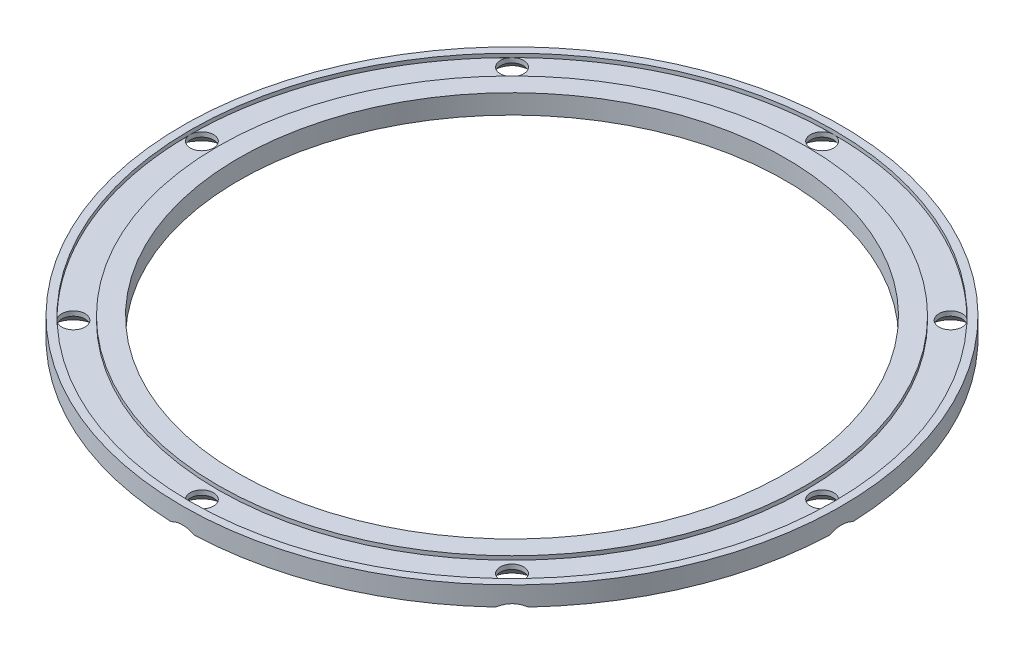
ISO-10303-21;
HEADER;
FILE_DESCRIPTION(('STEP AP214'),'2;1');
FILE_NAME('part.step','',(''),(''),'','','');
FILE_SCHEMA(('AUTOMOTIVE_DESIGN { 1 0 10303 214 1 1 1 1 }'));
ENDSEC;
DATA;
#1=APPLICATION_CONTEXT('core data for automotive mechanical design processes');
#2=APPLICATION_PROTOCOL_DEFINITION('international standard','automotive_design',2000,#1);
#3=PRODUCT_CONTEXT('',#1,'mechanical');
#4=PRODUCT('Part','Part','',(#3));
#5=PRODUCT_RELATED_PRODUCT_CATEGORY('part','',(#4));
#6=PRODUCT_DEFINITION_FORMATION('','',#4);
#7=PRODUCT_DEFINITION_CONTEXT('part definition',#1,'design');
#8=PRODUCT_DEFINITION('design','',#6,#7);
#9=PRODUCT_DEFINITION_SHAPE('','',#8);
#10=(LENGTH_UNIT() NAMED_UNIT(*) SI_UNIT(.MILLI.,.METRE.));
#11=(NAMED_UNIT(*) PLANE_ANGLE_UNIT() SI_UNIT($,.RADIAN.));
#12=(NAMED_UNIT(*) SI_UNIT($,.STERADIAN.) SOLID_ANGLE_UNIT());
#13=UNCERTAINTY_MEASURE_WITH_UNIT(LENGTH_MEASURE(1.E-05),#10,'distance_accuracy_value','');
#14=(GEOMETRIC_REPRESENTATION_CONTEXT(3) GLOBAL_UNCERTAINTY_ASSIGNED_CONTEXT((#13)) GLOBAL_UNIT_ASSIGNED_CONTEXT((#10,
#11,#12)) REPRESENTATION_CONTEXT('',''));
#15=CARTESIAN_POINT('',(0.,0.,0.));
#16=DIRECTION('',(0.,0.,1.));
#17=DIRECTION('',(1.,0.,0.));
#18=AXIS2_PLACEMENT_3D('',#15,#16,#17);
#19=CARTESIAN_POINT('',(0.,0.,0.));
#20=DIRECTION('',(0.,1.,0.));
#21=DIRECTION('',(0.,0.,1.));
#22=AXIS2_PLACEMENT_3D('',#19,#20,#21);
#23=PLANE('',#22);
#24=CARTESIAN_POINT('',(0.,0.,0.));
#25=DIRECTION('',(0.,1.,0.));
#26=DIRECTION('',(0.,0.,1.));
#27=AXIS2_PLACEMENT_3D('',#24,#25,#26);
#28=CIRCLE('',#27,35.25);
#29=CARTESIAN_POINT('',(0.,0.,35.25));
#30=VERTEX_POINT('',#29);
#31=EDGE_CURVE('E153',#30,#30,#28,.T.);
#32=ORIENTED_EDGE('',*,*,#31,.T.);
#33=EDGE_LOOP('',(#32));
#34=FACE_BOUND('',#33,.T.);
#35=CARTESIAN_POINT('',(-28.2842712474619,0.,28.2842712474619));
#36=DIRECTION('',(0.,-1.,0.));
#37=DIRECTION('',(0.,0.,-1.));
#38=AXIS2_PLACEMENT_3D('',#35,#36,#37);
#39=CIRCLE('',#38,2.9);
#40=CARTESIAN_POINT('',(-31.1039904340747,0.,28.9619022005978));
#41=VERTEX_POINT('',#40);
#42=CARTESIAN_POINT('',(-28.9619022005978,0.,31.1039904340747));
#43=VERTEX_POINT('',#42);
#44=EDGE_CURVE('E56',#41,#43,#39,.T.);
#45=ORIENTED_EDGE('',*,*,#44,.F.);
#46=CARTESIAN_POINT('',(0.,0.,0.));
#47=DIRECTION('',(0.,1.,0.));
#48=DIRECTION('',(0.,0.,1.));
#49=AXIS2_PLACEMENT_3D('',#46,#47,#48);
#50=CIRCLE('',#49,42.5);
#51=CARTESIAN_POINT('',(-42.473,0.,1.5146851157914));
#52=VERTEX_POINT('',#51);
#53=EDGE_CURVE('E135',#52,#41,#50,.T.);
#54=ORIENTED_EDGE('',*,*,#53,.F.);
#55=CARTESIAN_POINT('',(-40.,0.,0.));
#56=DIRECTION('',(0.,-1.,0.));
#57=DIRECTION('',(0.,0.,-1.));
#58=AXIS2_PLACEMENT_3D('',#55,#56,#57);
#59=CIRCLE('',#58,2.9);
#60=CARTESIAN_POINT('',(-42.473,0.,-1.51468511579139));
#61=VERTEX_POINT('',#60);
#62=EDGE_CURVE('E201',#61,#52,#59,.T.);
#63=ORIENTED_EDGE('',*,*,#62,.F.);
#64=CARTESIAN_POINT('',(-31.1039904340747,0.,-28.9619022005978));
#65=VERTEX_POINT('',#64);
#66=EDGE_CURVE('E145',#65,#61,#50,.T.);
#67=ORIENTED_EDGE('',*,*,#66,.F.);
#68=CARTESIAN_POINT('',(-28.2842712474619,0.,-28.2842712474619));
#69=DIRECTION('',(0.,-1.,0.));
#70=DIRECTION('',(0.,0.,-1.));
#71=AXIS2_PLACEMENT_3D('',#68,#69,#70);
#72=CIRCLE('',#71,2.9);
#73=CARTESIAN_POINT('',(-28.9619022005978,0.,-31.1039904340746));
#74=VERTEX_POINT('',#73);
#75=EDGE_CURVE('E207',#74,#65,#72,.T.);
#76=ORIENTED_EDGE('',*,*,#75,.F.);
#77=CARTESIAN_POINT('',(-1.5146851157914,0.,-42.473));
#78=VERTEX_POINT('',#77);
#79=EDGE_CURVE('E152',#78,#74,#50,.T.);
#80=ORIENTED_EDGE('',*,*,#79,.F.);
#81=CARTESIAN_POINT('',(0.,0.,-40.));
#82=DIRECTION('',(0.,-1.,0.));
#83=DIRECTION('',(0.,0.,-1.));
#84=AXIS2_PLACEMENT_3D('',#81,#82,#83);
#85=CIRCLE('',#84,2.9);
#86=CARTESIAN_POINT('',(1.51468511579138,0.,-42.473));
#87=VERTEX_POINT('',#86);
#88=EDGE_CURVE('E212',#87,#78,#85,.T.);
#89=ORIENTED_EDGE('',*,*,#88,.F.);
#90=CARTESIAN_POINT('',(28.9619022005978,0.,-31.1039904340747));
#91=VERTEX_POINT('',#90);
#92=EDGE_CURVE('E156',#91,#87,#50,.T.);
#93=ORIENTED_EDGE('',*,*,#92,.F.);
#94=CARTESIAN_POINT('',(28.2842712474619,0.,-28.2842712474619));
#95=DIRECTION('',(0.,-1.,0.));
#96=DIRECTION('',(0.,0.,-1.));
#97=AXIS2_PLACEMENT_3D('',#94,#95,#96);
#98=CIRCLE('',#97,2.9);
#99=CARTESIAN_POINT('',(31.1039904340747,0.,-28.9619022005978));
#100=VERTEX_POINT('',#99);
#101=EDGE_CURVE('E217',#100,#91,#98,.T.);
#102=ORIENTED_EDGE('',*,*,#101,.F.);
#103=CARTESIAN_POINT('',(42.473,0.,-1.51468511579141));
#104=VERTEX_POINT('',#103);
#105=EDGE_CURVE('E576',#104,#100,#50,.T.);
#106=ORIENTED_EDGE('',*,*,#105,.F.);
#107=CARTESIAN_POINT('',(40.,0.,0.));
#108=DIRECTION('',(0.,-1.,0.));
#109=DIRECTION('',(0.,0.,-1.));
#110=AXIS2_PLACEMENT_3D('',#107,#108,#109);
#111=CIRCLE('',#110,2.9);
#112=CARTESIAN_POINT('',(42.473,0.,1.51468511579138));
#113=VERTEX_POINT('',#112);
#114=EDGE_CURVE('E222',#113,#104,#111,.T.);
#115=ORIENTED_EDGE('',*,*,#114,.F.);
#116=CARTESIAN_POINT('',(31.1039904340747,0.,28.9619022005978));
#117=VERTEX_POINT('',#116);
#118=EDGE_CURVE('E571',#117,#113,#50,.T.);
#119=ORIENTED_EDGE('',*,*,#118,.F.);
#120=CARTESIAN_POINT('',(28.2842712474619,0.,28.2842712474619));
#121=DIRECTION('',(0.,-1.,0.));
#122=DIRECTION('',(0.,0.,-1.));
#123=AXIS2_PLACEMENT_3D('',#120,#121,#122);
#124=CIRCLE('',#123,2.9);
#125=CARTESIAN_POINT('',(28.9619022005978,0.,31.1039904340747));
#126=VERTEX_POINT('',#125);
#127=EDGE_CURVE('E227',#126,#117,#124,.T.);
#128=ORIENTED_EDGE('',*,*,#127,.F.);
#129=CARTESIAN_POINT('',(1.5146851157914,0.,42.473));
#130=VERTEX_POINT('',#129);
#131=EDGE_CURVE('E149',#130,#126,#50,.T.);
#132=ORIENTED_EDGE('',*,*,#131,.F.);
#133=CARTESIAN_POINT('',(0.,0.,40.));
#134=DIRECTION('',(0.,-1.,0.));
#135=DIRECTION('',(0.,0.,-1.));
#136=AXIS2_PLACEMENT_3D('',#133,#134,#135);
#137=CIRCLE('',#136,2.9);
#138=CARTESIAN_POINT('',(-1.5146851157914,0.,42.473));
#139=VERTEX_POINT('',#138);
#140=EDGE_CURVE('E62',#139,#130,#137,.T.);
#141=ORIENTED_EDGE('',*,*,#140,.F.);
#142=EDGE_CURVE('E136',#43,#139,#50,.T.);
#143=ORIENTED_EDGE('',*,*,#142,.F.);
#144=EDGE_LOOP('',(#45,#54,#63,#67,#76,#80,#89,#93,#102,#106,#115,#119,#128,#132,#141,#143));
#145=FACE_BOUND('',#144,.T.);
#146=ADVANCED_FACE('F38',(#34,#145),#23,.F.);
#147=CARTESIAN_POINT('',(0.,2.5,0.));
#148=DIRECTION('',(0.,1.,0.));
#149=DIRECTION('',(0.,0.,1.));
#150=AXIS2_PLACEMENT_3D('',#147,#148,#149);
#151=PLANE('',#150);
#152=CARTESIAN_POINT('',(0.,2.5,0.));
#153=DIRECTION('',(0.,1.,0.));
#154=DIRECTION('',(0.,0.,1.));
#155=AXIS2_PLACEMENT_3D('',#152,#153,#154);
#156=CIRCLE('',#155,35.25);
#157=CARTESIAN_POINT('',(0.,2.5,35.25));
#158=VERTEX_POINT('',#157);
#159=EDGE_CURVE('E143',#158,#158,#156,.T.);
#160=ORIENTED_EDGE('',*,*,#159,.F.);
#161=EDGE_LOOP('',(#160));
#162=FACE_BOUND('',#161,.T.);
#163=CARTESIAN_POINT('',(0.,2.5,0.));
#164=DIRECTION('',(0.,1.,0.));
#165=DIRECTION('',(0.,0.,1.));
#166=AXIS2_PLACEMENT_3D('',#163,#164,#165);
#167=CIRCLE('',#166,37.9);
#168=CARTESIAN_POINT('',(0.,2.5,37.9));
#169=VERTEX_POINT('',#168);
#170=EDGE_CURVE('E193',#169,#169,#167,.T.);
#171=ORIENTED_EDGE('',*,*,#170,.T.);
#172=EDGE_LOOP('',(#171));
#173=FACE_BOUND('',#172,.T.);
#174=ADVANCED_FACE('F249',(#162,#173),#151,.T.);
#175=CARTESIAN_POINT('',(-28.2842712474619,2.5,28.2842712474619));
#176=DIRECTION('',(0.,-1.,0.));
#177=DIRECTION('',(0.,0.,-1.));
#178=AXIS2_PLACEMENT_3D('',#175,#176,#177);
#179=CYLINDRICAL_SURFACE('',#178,1.5);
#180=CARTESIAN_POINT('',(-28.2842712474619,1.4,28.2842712474619));
#181=DIRECTION('',(0.,-1.,0.));
#182=DIRECTION('',(0.,0.,-1.));
#183=AXIS2_PLACEMENT_3D('',#180,#181,#182);
#184=CIRCLE('',#183,1.5);
#185=CARTESIAN_POINT('',(-28.2842712474619,1.4,26.7842712474619));
#186=VERTEX_POINT('',#185);
#187=EDGE_CURVE('E137',#186,#186,#184,.T.);
#188=ORIENTED_EDGE('',*,*,#187,.T.);
#189=EDGE_LOOP('',(#188));
#190=FACE_BOUND('',#189,.T.);
#191=CARTESIAN_POINT('',(-28.2842712474619,2.,28.2842712474619));
#192=DIRECTION('',(0.,1.,0.));
#193=DIRECTION('',(0.,0.,1.));
#194=AXIS2_PLACEMENT_3D('',#191,#192,#193);
#195=CIRCLE('',#194,1.5);
#196=CARTESIAN_POINT('',(-29.3449314192417,2.,29.3449314192417));
#197=VERTEX_POINT('',#196);
#198=EDGE_CURVE('E158',#197,#197,#195,.F.);
#199=ORIENTED_EDGE('',*,*,#198,.F.);
#200=EDGE_LOOP('',(#199));
#201=FACE_BOUND('',#200,.T.);
#202=ADVANCED_FACE('F236',(#190,#201),#179,.F.);
#203=CARTESIAN_POINT('',(-40.,2.5,0.));
#204=DIRECTION('',(0.,-1.,0.));
#205=DIRECTION('',(0.,0.,-1.));
#206=AXIS2_PLACEMENT_3D('',#203,#204,#205);
#207=CYLINDRICAL_SURFACE('',#206,1.5);
#208=CARTESIAN_POINT('',(-40.,1.4,0.));
#209=DIRECTION('',(0.,-1.,0.));
#210=DIRECTION('',(0.,0.,-1.));
#211=AXIS2_PLACEMENT_3D('',#208,#209,#210);
#212=CIRCLE('',#211,1.5);
#213=CARTESIAN_POINT('',(-40.,1.4,-1.50000000000001));
#214=VERTEX_POINT('',#213);
#215=EDGE_CURVE('E196',#214,#214,#212,.T.);
#216=ORIENTED_EDGE('',*,*,#215,.T.);
#217=EDGE_LOOP('',(#216));
#218=FACE_BOUND('',#217,.T.);
#219=CARTESIAN_POINT('',(-40.,2.,0.));
#220=DIRECTION('',(0.,1.,0.));
#221=DIRECTION('',(0.,0.,1.));
#222=AXIS2_PLACEMENT_3D('',#219,#220,#221);
#223=CIRCLE('',#222,1.5);
#224=CARTESIAN_POINT('',(-41.5,2.,0.));
#225=VERTEX_POINT('',#224);
#226=EDGE_CURVE('E162',#225,#225,#223,.F.);
#227=ORIENTED_EDGE('',*,*,#226,.F.);
#228=EDGE_LOOP('',(#227));
#229=FACE_BOUND('',#228,.T.);
#230=ADVANCED_FACE('F365',(#218,#229),#207,.F.);
#231=CARTESIAN_POINT('',(-28.2842712474619,2.5,-28.2842712474619));
#232=DIRECTION('',(0.,-1.,0.));
#233=DIRECTION('',(0.,0.,-1.));
#234=AXIS2_PLACEMENT_3D('',#231,#232,#233);
#235=CYLINDRICAL_SURFACE('',#234,1.5);
#236=CARTESIAN_POINT('',(-28.2842712474619,1.4,-28.2842712474619));
#237=DIRECTION('',(0.,-1.,0.));
#238=DIRECTION('',(0.,0.,-1.));
#239=AXIS2_PLACEMENT_3D('',#236,#237,#238);
#240=CIRCLE('',#239,1.5);
#241=CARTESIAN_POINT('',(-28.2842712474619,1.4,-29.7842712474619));
#242=VERTEX_POINT('',#241);
#243=EDGE_CURVE('E203',#242,#242,#240,.T.);
#244=ORIENTED_EDGE('',*,*,#243,.T.);
#245=EDGE_LOOP('',(#244));
#246=FACE_BOUND('',#245,.T.);
#247=CARTESIAN_POINT('',(-28.2842712474619,2.,-28.2842712474619));
#248=DIRECTION('',(0.,1.,0.));
#249=DIRECTION('',(0.,0.,1.));
#250=AXIS2_PLACEMENT_3D('',#247,#248,#249);
#251=CIRCLE('',#250,1.5);
#252=CARTESIAN_POINT('',(-29.3449314192417,2.,-29.3449314192417));
#253=VERTEX_POINT('',#252);
#254=EDGE_CURVE('E170',#253,#253,#251,.F.);
#255=ORIENTED_EDGE('',*,*,#254,.F.);
#256=EDGE_LOOP('',(#255));
#257=FACE_BOUND('',#256,.T.);
#258=ADVANCED_FACE('F361',(#246,#257),#235,.F.);
#259=CARTESIAN_POINT('',(0.,2.5,-40.));
#260=DIRECTION('',(0.,-1.,0.));
#261=DIRECTION('',(0.,0.,-1.));
#262=AXIS2_PLACEMENT_3D('',#259,#260,#261);
#263=CYLINDRICAL_SURFACE('',#262,1.5);
#264=CARTESIAN_POINT('',(0.,1.4,-40.));
#265=DIRECTION('',(0.,-1.,0.));
#266=DIRECTION('',(0.,0.,-1.));
#267=AXIS2_PLACEMENT_3D('',#264,#265,#266);
#268=CIRCLE('',#267,1.5);
#269=CARTESIAN_POINT('',(0.,1.4,-41.5));
#270=VERTEX_POINT('',#269);
#271=EDGE_CURVE('E206',#270,#270,#268,.T.);
#272=ORIENTED_EDGE('',*,*,#271,.T.);
#273=EDGE_LOOP('',(#272));
#274=FACE_BOUND('',#273,.T.);
#275=CARTESIAN_POINT('',(0.,2.,-40.));
#276=DIRECTION('',(0.,1.,0.));
#277=DIRECTION('',(0.,0.,1.));
#278=AXIS2_PLACEMENT_3D('',#275,#276,#277);
#279=CIRCLE('',#278,1.5);
#280=CARTESIAN_POINT('',(0.,2.,-41.5));
#281=VERTEX_POINT('',#280);
#282=EDGE_CURVE('E173',#281,#281,#279,.F.);
#283=ORIENTED_EDGE('',*,*,#282,.F.);
#284=EDGE_LOOP('',(#283));
#285=FACE_BOUND('',#284,.T.);
#286=ADVANCED_FACE('F357',(#274,#285),#263,.F.);
#287=CARTESIAN_POINT('',(28.2842712474619,2.5,-28.2842712474619));
#288=DIRECTION('',(0.,-1.,0.));
#289=DIRECTION('',(0.,0.,-1.));
#290=AXIS2_PLACEMENT_3D('',#287,#288,#289);
#291=CYLINDRICAL_SURFACE('',#290,1.5);
#292=CARTESIAN_POINT('',(28.2842712474619,1.4,-28.2842712474619));
#293=DIRECTION('',(0.,-1.,0.));
#294=DIRECTION('',(0.,0.,-1.));
#295=AXIS2_PLACEMENT_3D('',#292,#293,#294);
#296=CIRCLE('',#295,1.5);
#297=CARTESIAN_POINT('',(28.2842712474619,1.4,-29.7842712474619));
#298=VERTEX_POINT('',#297);
#299=EDGE_CURVE('E214',#298,#298,#296,.T.);
#300=ORIENTED_EDGE('',*,*,#299,.T.);
#301=EDGE_LOOP('',(#300));
#302=FACE_BOUND('',#301,.T.);
#303=CARTESIAN_POINT('',(28.2842712474619,2.,-28.2842712474619));
#304=DIRECTION('',(0.,1.,0.));
#305=DIRECTION('',(0.,0.,1.));
#306=AXIS2_PLACEMENT_3D('',#303,#304,#305);
#307=CIRCLE('',#306,1.5);
#308=CARTESIAN_POINT('',(29.3449314192417,2.,-29.3449314192417));
#309=VERTEX_POINT('',#308);
#310=EDGE_CURVE('E176',#309,#309,#307,.F.);
#311=ORIENTED_EDGE('',*,*,#310,.F.);
#312=EDGE_LOOP('',(#311));
#313=FACE_BOUND('',#312,.T.);
#314=ADVANCED_FACE('F353',(#302,#313),#291,.F.);
#315=CARTESIAN_POINT('',(40.,2.5,0.));
#316=DIRECTION('',(0.,-1.,0.));
#317=DIRECTION('',(0.,0.,-1.));
#318=AXIS2_PLACEMENT_3D('',#315,#316,#317);
#319=CYLINDRICAL_SURFACE('',#318,1.50000000000014);
#320=CARTESIAN_POINT('',(40.,1.4,0.));
#321=DIRECTION('',(0.,-1.,0.));
#322=DIRECTION('',(0.,0.,-1.));
#323=AXIS2_PLACEMENT_3D('',#320,#321,#322);
#324=CIRCLE('',#323,1.5);
#325=CARTESIAN_POINT('',(40.,1.4,-1.5));
#326=VERTEX_POINT('',#325);
#327=EDGE_CURVE('E219',#326,#326,#324,.T.);
#328=ORIENTED_EDGE('',*,*,#327,.T.);
#329=EDGE_LOOP('',(#328));
#330=FACE_BOUND('',#329,.T.);
#331=CARTESIAN_POINT('',(40.,2.,0.));
#332=DIRECTION('',(0.,1.,0.));
#333=DIRECTION('',(0.,0.,1.));
#334=AXIS2_PLACEMENT_3D('',#331,#332,#333);
#335=CIRCLE('',#334,1.50000000000014);
#336=CARTESIAN_POINT('',(41.5,2.,0.));
#337=VERTEX_POINT('',#336);
#338=EDGE_CURVE('E179',#337,#337,#335,.F.);
#339=ORIENTED_EDGE('',*,*,#338,.F.);
#340=EDGE_LOOP('',(#339));
#341=FACE_BOUND('',#340,.T.);
#342=ADVANCED_FACE('F349',(#330,#341),#319,.F.);
#343=CARTESIAN_POINT('',(28.2842712474619,2.5,28.2842712474619));
#344=DIRECTION('',(0.,-1.,0.));
#345=DIRECTION('',(0.,0.,-1.));
#346=AXIS2_PLACEMENT_3D('',#343,#344,#345);
#347=CYLINDRICAL_SURFACE('',#346,1.50000000000008);
#348=CARTESIAN_POINT('',(28.2842712474619,1.4,28.2842712474619));
#349=DIRECTION('',(0.,-1.,0.));
#350=DIRECTION('',(0.,0.,-1.));
#351=AXIS2_PLACEMENT_3D('',#348,#349,#350);
#352=CIRCLE('',#351,1.5);
#353=CARTESIAN_POINT('',(28.2842712474619,1.4,26.7842712474619));
#354=VERTEX_POINT('',#353);
#355=EDGE_CURVE('E224',#354,#354,#352,.T.);
#356=ORIENTED_EDGE('',*,*,#355,.T.);
#357=EDGE_LOOP('',(#356));
#358=FACE_BOUND('',#357,.T.);
#359=CARTESIAN_POINT('',(28.2842712474619,2.,28.2842712474619));
#360=DIRECTION('',(0.,1.,0.));
#361=DIRECTION('',(0.,0.,1.));
#362=AXIS2_PLACEMENT_3D('',#359,#360,#361);
#363=CIRCLE('',#362,1.50000000000008);
#364=CARTESIAN_POINT('',(29.3449314192417,2.,29.3449314192417));
#365=VERTEX_POINT('',#364);
#366=EDGE_CURVE('E182',#365,#365,#363,.F.);
#367=ORIENTED_EDGE('',*,*,#366,.F.);
#368=EDGE_LOOP('',(#367));
#369=FACE_BOUND('',#368,.T.);
#370=ADVANCED_FACE('F345',(#358,#369),#347,.F.);
#371=CARTESIAN_POINT('',(0.,2.5,40.));
#372=DIRECTION('',(0.,-1.,0.));
#373=DIRECTION('',(0.,0.,-1.));
#374=AXIS2_PLACEMENT_3D('',#371,#372,#373);
#375=CYLINDRICAL_SURFACE('',#374,1.5);
#376=CARTESIAN_POINT('',(0.,1.4,40.));
#377=DIRECTION('',(0.,-1.,0.));
#378=DIRECTION('',(0.,0.,-1.));
#379=AXIS2_PLACEMENT_3D('',#376,#377,#378);
#380=CIRCLE('',#379,1.5);
#381=CARTESIAN_POINT('',(0.,1.4,38.5));
#382=VERTEX_POINT('',#381);
#383=EDGE_CURVE('E229',#382,#382,#380,.T.);
#384=ORIENTED_EDGE('',*,*,#383,.T.);
#385=EDGE_LOOP('',(#384));
#386=FACE_BOUND('',#385,.T.);
#387=CARTESIAN_POINT('',(0.,2.,40.));
#388=DIRECTION('',(0.,1.,0.));
#389=DIRECTION('',(0.,0.,1.));
#390=AXIS2_PLACEMENT_3D('',#387,#388,#389);
#391=CIRCLE('',#390,1.5);
#392=CARTESIAN_POINT('',(0.,2.,41.5));
#393=VERTEX_POINT('',#392);
#394=EDGE_CURVE('E166',#393,#393,#391,.F.);
#395=ORIENTED_EDGE('',*,*,#394,.F.);
#396=EDGE_LOOP('',(#395));
#397=FACE_BOUND('',#396,.T.);
#398=ADVANCED_FACE('F342',(#386,#397),#375,.F.);
#399=CARTESIAN_POINT('',(0.,2.5,0.));
#400=DIRECTION('',(0.,-1.,0.));
#401=DIRECTION('',(0.,0.,-1.));
#402=AXIS2_PLACEMENT_3D('',#399,#400,#401);
#403=CYLINDRICAL_SURFACE('',#402,35.25);
#404=ORIENTED_EDGE('',*,*,#159,.T.);
#405=EDGE_LOOP('',(#404));
#406=FACE_BOUND('',#405,.T.);
#407=ORIENTED_EDGE('',*,*,#31,.F.);
#408=EDGE_LOOP('',(#407));
#409=FACE_BOUND('',#408,.T.);
#410=ADVANCED_FACE('F40',(#406,#409),#403,.F.);
#411=CARTESIAN_POINT('',(0.,2.5,0.));
#412=DIRECTION('',(0.,-1.,0.));
#413=DIRECTION('',(0.,0.,-1.));
#414=AXIS2_PLACEMENT_3D('',#411,#412,#413);
#415=CYLINDRICAL_SURFACE('',#414,42.5);
#416=CARTESIAN_POINT('',(0.,2.5,0.));
#417=DIRECTION('',(0.,1.,0.));
#418=DIRECTION('',(0.,0.,1.));
#419=AXIS2_PLACEMENT_3D('',#416,#417,#418);
#420=CIRCLE('',#419,42.5);
#421=CARTESIAN_POINT('',(0.,2.5,42.5));
#422=VERTEX_POINT('',#421);
#423=EDGE_CURVE('E147',#422,#422,#420,.T.);
#424=ORIENTED_EDGE('',*,*,#423,.F.);
#425=EDGE_LOOP('',(#424));
#426=FACE_BOUND('',#425,.T.);
#427=ORIENTED_EDGE('',*,*,#53,.T.);
#428=CARTESIAN_POINT('',(-31.1042676557551,-0.000200000000568581,28.9616044721136));
#429=CARTESIAN_POINT('',(-31.0429359571529,0.0440197295765726,29.0274726949475));
#430=CARTESIAN_POINT('',(-30.9805638482108,0.0859757049449392,29.0940406191825));
#431=CARTESIAN_POINT('',(-30.8534230796494,0.164015595208351,29.2288370605861));
#432=CARTESIAN_POINT('',(-30.788646535956,0.200077621123897,29.2970707324646));
#433=CARTESIAN_POINT('',(-30.657297107552,0.264411043643407,29.4344881636468));
#434=CARTESIAN_POINT('',(-30.5907403895116,0.29273632983753,29.5036616335611));
#435=CARTESIAN_POINT('',(-30.4556527101295,0.340224523448975,29.6430871323514));
#436=CARTESIAN_POINT('',(-30.3871246992047,0.35940043799836,29.713337482655));
#437=CARTESIAN_POINT('',(-30.2623640873376,0.384440512409582,29.8403349244142));
#438=CARTESIAN_POINT('',(-30.2064067534656,0.392197450456359,29.8969791917208));
#439=CARTESIAN_POINT('',(-30.0938929018489,0.400536320885343,30.0102312380642));
#440=CARTESIAN_POINT('',(-30.037336301435,0.401117250087401,30.0668390108931));
#441=CARTESIAN_POINT('',(-29.9240802250548,0.395062335804823,30.1795594552243));
#442=CARTESIAN_POINT('',(-29.8673807011311,0.388423616147201,30.2356719204244));
#443=CARTESIAN_POINT('',(-29.7542982157989,0.36830726585742,30.346960930303));
#444=CARTESIAN_POINT('',(-29.6979152392807,0.354829964501868,30.4021375199117));
#445=CARTESIAN_POINT('',(-29.524983771731,0.303740964903088,30.5704415561265));
#446=CARTESIAN_POINT('',(-29.4095287363077,0.255809063992505,30.6814928169204));
#447=CARTESIAN_POINT('',(-29.1824318119451,0.14052268440478,30.8975795964472));
#448=CARTESIAN_POINT('',(-29.0707918615157,0.0731584912674208,31.0026120747538));
#449=CARTESIAN_POINT('',(-28.9616044721141,-0.000200000000222656,31.1042676557546));
#450=B_SPLINE_CURVE_WITH_KNOTS('',3,(#428,#429,#430,#431,#432,#433,#434,#435,#436,#437,#438,
#439,#440,#441,#442,#443,#444,#445,#446,#447,#448,#449),.UNSPECIFIED.,.F.,.F.,(4,2,2,2,2,2,2,2,
2,2,4),(0.,0.300947904302479,0.602989250754861,0.902869748892798,1.20232264455971,
1.44201937951658,1.6817496228332,1.92157540518937,2.16138964106833,2.66139302594227,
3.16164680359814),.UNSPECIFIED.);
#451=EDGE_CURVE('E11',#41,#43,#450,.T.);
#452=ORIENTED_EDGE('',*,*,#451,.T.);
#453=ORIENTED_EDGE('',*,*,#142,.T.);
#454=CARTESIAN_POINT('',(-1.51509166695047,-0.000199999999997996,42.4729854995));
#455=CARTESIAN_POINT('',(-1.4251477399366,0.0440197295771084,42.4761933065473));
#456=CARTESIAN_POINT('',(-1.33397336811079,0.0859757049454364,42.4791601959935));
#457=CARTESIAN_POINT('',(-1.14875579069944,0.164015595208769,42.4845735741748));
#458=CARTESIAN_POINT('',(-1.05470336530153,0.200077621124275,42.4870181329579));
#459=CARTESIAN_POINT('',(-0.864656496329981,0.264411043643708,42.4913088588706));
#460=CARTESIAN_POINT('',(-0.768680760015409,0.292736329837793,42.4931591818653));
#461=CARTESIAN_POINT('',(-0.57457063020478,0.340224523449162,42.4962264833844));
#462=CARTESIAN_POINT('',(-0.476439509898253,0.359400437998509,42.4974443612387));
#463=CARTESIAN_POINT('',(-0.298419682960758,0.384440512409674,42.4990260388237));
#464=CARTESIAN_POINT('',(-0.218798327194902,0.392197450456428,42.4995117741135));
#465=CARTESIAN_POINT('',(-0.0591577297866696,0.400536320885364,42.5000337566106));
#466=CARTESIAN_POINT('',(0.0208615659220801,0.401117250087396,42.5000699409723));
#467=CARTESIAN_POINT('',(0.180651096106051,0.395062335804767,42.4996911919181));
#468=CARTESIAN_POINT('',(0.260421218614595,0.388423616147118,42.4992760787138));
#469=CARTESIAN_POINT('',(0.41907582438321,0.368307265857285,42.4980079000587));
#470=CARTESIAN_POINT('',(0.497960350097718,0.35482996450171,42.4971548556942));
#471=CARTESIAN_POINT('',(0.739250288791029,0.303740964902892,42.4938827676178));
#472=CARTESIAN_POINT('',(0.899414426827509,0.255809063992326,42.4907688287146));
#473=CARTESIAN_POINT('',(1.21279262915871,0.14052268440468,42.4829834806393));
#474=CARTESIAN_POINT('',(1.36600317281399,0.073158491267383,42.4783112922948));
#475=CARTESIAN_POINT('',(1.51509166695085,-0.000200000000186416,42.4729854995));
#476=B_SPLINE_CURVE_WITH_KNOTS('',3,(#454,#455,#456,#457,#458,#459,#460,#461,#462,#463,#464,
#465,#466,#467,#468,#469,#470,#471,#472,#473,#474,#475),.UNSPECIFIED.,.F.,.F.,(4,2,2,2,2,2,2,2,
2,2,4),(0.,0.300947904302366,0.602989250754638,0.902869748892458,1.20232264455925,
1.44201937951614,1.68174962283277,1.92157540518895,2.16138964106793,2.6613930259414,
3.16164680359677),.UNSPECIFIED.);
#477=EDGE_CURVE('E50',#139,#130,#476,.T.);
#478=ORIENTED_EDGE('',*,*,#477,.T.);
#479=ORIENTED_EDGE('',*,*,#131,.T.);
#480=CARTESIAN_POINT('',(28.9616044721144,-0.000199999999999742,31.1042676557543));
#481=CARTESIAN_POINT('',(29.0274726949484,0.0440197295771065,31.0429359571521));
#482=CARTESIAN_POINT('',(29.0940406191833,0.0859757049454355,30.9805638482101));
#483=CARTESIAN_POINT('',(29.2288370605869,0.164015595208771,30.8534230796487));
#484=CARTESIAN_POINT('',(29.2970707324653,0.200077621124278,30.7886465359553));
#485=CARTESIAN_POINT('',(29.4344881636475,0.26441104364371,30.6572971075513));
#486=CARTESIAN_POINT('',(29.5036616335618,0.292736329837794,30.5907403895109));
#487=CARTESIAN_POINT('',(29.6430871323521,0.340224523449165,30.4556527101289));
#488=CARTESIAN_POINT('',(29.7133374826556,0.359400437998514,30.3871246992041));
#489=CARTESIAN_POINT('',(29.8403349244148,0.384440512409676,30.262364087337));
#490=CARTESIAN_POINT('',(29.8969791917214,0.392197450456426,30.206406753465));
#491=CARTESIAN_POINT('',(30.0102312380648,0.40053632088536,30.0938929018483));
#492=CARTESIAN_POINT('',(30.0668390108937,0.401117250087394,30.0373363014344));
#493=CARTESIAN_POINT('',(30.1795594552249,0.395062335804766,29.9240802250541));
#494=CARTESIAN_POINT('',(30.235671920425,0.388423616147117,29.8673807011305));
#495=CARTESIAN_POINT('',(30.3469609303037,0.368307265857285,29.7542982157982));
#496=CARTESIAN_POINT('',(30.4021375199123,0.35482996450171,29.69791523928));
#497=CARTESIAN_POINT('',(30.5704415561271,0.303740964902864,29.5249837717304));
#498=CARTESIAN_POINT('',(30.681492816921,0.255809063992243,29.4095287363071));
#499=CARTESIAN_POINT('',(30.8975795964477,0.14052268440446,29.1824318119446));
#500=CARTESIAN_POINT('',(31.0026120747543,0.0731584912670825,29.0707918615152));
#501=CARTESIAN_POINT('',(31.104267655755,-0.000200000000568314,28.9616044721136));
#502=B_SPLINE_CURVE_WITH_KNOTS('',3,(#480,#481,#482,#483,#484,#485,#486,#487,#488,#489,#490,
#491,#492,#493,#494,#495,#496,#497,#498,#499,#500,#501),.UNSPECIFIED.,.F.,.F.,(4,2,2,2,2,2,2,2,
2,2,4),(0.,0.300947904302366,0.60298925075464,0.90286974889246,1.20232264455926,
1.44201937951614,1.68174962283277,1.92157540518896,2.16138964106793,2.66139302594183,
3.16164680359764),.UNSPECIFIED.);
#503=EDGE_CURVE('E297',#126,#117,#502,.T.);
#504=ORIENTED_EDGE('',*,*,#503,.T.);
#505=ORIENTED_EDGE('',*,*,#118,.T.);
#506=CARTESIAN_POINT('',(42.4729854995,-0.000200000000186674,1.51509166695086));
#507=CARTESIAN_POINT('',(42.4761933065473,0.0440197295769308,1.42514773993698));
#508=CARTESIAN_POINT('',(42.4791601959935,0.0859757049452725,1.33397336811117));
#509=CARTESIAN_POINT('',(42.4845735741748,0.164015595208634,1.1487557906998));
#510=CARTESIAN_POINT('',(42.4870181329579,0.200077621124154,1.05470336530189));
#511=CARTESIAN_POINT('',(42.4913088588706,0.264411043643611,0.864656496330314));
#512=CARTESIAN_POINT('',(42.4931591818653,0.292736329837706,0.768680760015732));
#513=CARTESIAN_POINT('',(42.4962264833844,0.340224523449102,0.574570630205082));
#514=CARTESIAN_POINT('',(42.4974443612387,0.359400437998464,0.476439509898545));
#515=CARTESIAN_POINT('',(42.4990260388237,0.384440512409647,0.298419682961041));
#516=CARTESIAN_POINT('',(42.4995117741135,0.392197450456405,0.218798327195188));
#517=CARTESIAN_POINT('',(42.5000337566106,0.400536320885357,0.0591577297869592));
#518=CARTESIAN_POINT('',(42.5000699409723,0.401117250087399,-0.0208615659217888));
#519=CARTESIAN_POINT('',(42.4996911919181,0.395062335804788,-0.180651096105757));
#520=CARTESIAN_POINT('',(42.4992760787138,0.388423616147149,-0.260421218614299));
#521=CARTESIAN_POINT('',(42.4980079000587,0.368307265857334,-0.419075824382913));
#522=CARTESIAN_POINT('',(42.4971548556942,0.354829964501768,-0.49796035009742));
#523=CARTESIAN_POINT('',(42.4938827676179,0.303740964902979,-0.739250288790713));
#524=CARTESIAN_POINT('',(42.4907688287146,0.25580906399243,-0.899414426827175));
#525=CARTESIAN_POINT('',(42.4829834806393,0.140522684404821,-1.21279262915835));
#526=CARTESIAN_POINT('',(42.4783112922948,0.0731584912675444,-1.36600317281361));
#527=CARTESIAN_POINT('',(42.4729854995,-0.000199999999997355,-1.51509166695047));
#528=B_SPLINE_CURVE_WITH_KNOTS('',3,(#506,#507,#508,#509,#510,#511,#512,#513,#514,#515,#516,
#517,#518,#519,#520,#521,#522,#523,#524,#525,#526,#527),.UNSPECIFIED.,.F.,.F.,(4,2,2,2,2,2,2,2,
2,2,4),(0.,0.300947904302401,0.602989250754708,0.902869748892567,1.2023226445594,
1.44201937951628,1.68174962283291,1.92157540518909,2.16138964106805,2.66139302594146,
3.16164680359677),.UNSPECIFIED.);
#529=EDGE_CURVE('E291',#113,#104,#528,.T.);
#530=ORIENTED_EDGE('',*,*,#529,.T.);
#531=ORIENTED_EDGE('',*,*,#105,.T.);
#532=CARTESIAN_POINT('',(31.1042676557551,-0.000200000000571712,-28.9616044721136));
#533=CARTESIAN_POINT('',(31.0429359571529,0.0440197295765654,-29.0274726949475));
#534=CARTESIAN_POINT('',(30.9805638482108,0.0859757049449316,-29.0940406191825));
#535=CARTESIAN_POINT('',(30.8534230796494,0.164015595208346,-29.2288370605861));
#536=CARTESIAN_POINT('',(30.788646535956,0.200077621123895,-29.2970707324646));
#537=CARTESIAN_POINT('',(30.657297107552,0.264411043643407,-29.4344881636467));
#538=CARTESIAN_POINT('',(30.5907403895116,0.292736329837529,-29.5036616335611));
#539=CARTESIAN_POINT('',(30.4556527101295,0.340224523448975,-29.6430871323514));
#540=CARTESIAN_POINT('',(30.3871246992047,0.359400437998363,-29.713337482655));
#541=CARTESIAN_POINT('',(30.2623640873376,0.384440512409583,-29.8403349244142));
#542=CARTESIAN_POINT('',(30.2064067534656,0.392197450456357,-29.8969791917208));
#543=CARTESIAN_POINT('',(30.0938929018489,0.400536320885342,-30.0102312380642));
#544=CARTESIAN_POINT('',(30.037336301435,0.401117250087401,-30.0668390108931));
#545=CARTESIAN_POINT('',(29.9240802250548,0.395062335804825,-30.1795594552243));
#546=CARTESIAN_POINT('',(29.8673807011311,0.388423616147203,-30.2356719204244));
#547=CARTESIAN_POINT('',(29.7542982157989,0.368307265857422,-30.346960930303));
#548=CARTESIAN_POINT('',(29.6979152392807,0.354829964501871,-30.4021375199117));
#549=CARTESIAN_POINT('',(29.5249837717311,0.303740964903108,-30.5704415561265));
#550=CARTESIAN_POINT('',(29.4095287363079,0.255809063992554,-30.6814928169203));
#551=CARTESIAN_POINT('',(29.1824318119453,0.140522684404903,-30.8975795964469));
#552=CARTESIAN_POINT('',(29.070791861516,0.0731584912675892,-31.0026120747536));
#553=CARTESIAN_POINT('',(28.9616044721144,-0.000200000000002927,-31.1042676557543));
#554=B_SPLINE_CURVE_WITH_KNOTS('',3,(#532,#533,#534,#535,#536,#537,#538,#539,#540,#541,#542,
#543,#544,#545,#546,#547,#548,#549,#550,#551,#552,#553),.UNSPECIFIED.,.F.,.F.,(4,2,2,2,2,2,2,2,
2,2,4),(0.,0.300947904302473,0.602989250754857,0.902869748892796,1.20232264455971,
1.44201937951658,1.6817496228332,1.92157540518937,2.16138964106833,2.66139302594203,
3.16164680359765),.UNSPECIFIED.);
#555=EDGE_CURVE('E284',#100,#91,#554,.T.);
#556=ORIENTED_EDGE('',*,*,#555,.T.);
#557=ORIENTED_EDGE('',*,*,#92,.T.);
#558=CARTESIAN_POINT('',(1.51509166695086,-0.000200000000186673,-42.4729854995));
#559=CARTESIAN_POINT('',(1.42514773993698,0.0440197295769307,-42.4761933065473));
#560=CARTESIAN_POINT('',(1.33397336811117,0.0859757049452724,-42.4791601959935));
#561=CARTESIAN_POINT('',(1.1487557906998,0.164015595208633,-42.4845735741748));
#562=CARTESIAN_POINT('',(1.05470336530189,0.200077621124154,-42.4870181329579));
#563=CARTESIAN_POINT('',(0.864656496330316,0.264411043643611,-42.4913088588706));
#564=CARTESIAN_POINT('',(0.768680760015734,0.292736329837706,-42.4931591818653));
#565=CARTESIAN_POINT('',(0.574570630205084,0.340224523449102,-42.4962264833844));
#566=CARTESIAN_POINT('',(0.476439509898546,0.359400437998464,-42.4974443612387));
#567=CARTESIAN_POINT('',(0.298419682961043,0.384440512409647,-42.4990260388237));
#568=CARTESIAN_POINT('',(0.218798327195189,0.392197450456405,-42.4995117741135));
#569=CARTESIAN_POINT('',(0.0591577297869609,0.400536320885356,-42.5000337566106));
#570=CARTESIAN_POINT('',(-0.0208615659217872,0.401117250087398,-42.5000699409723));
#571=CARTESIAN_POINT('',(-0.180651096105755,0.395062335804788,-42.4996911919181));
#572=CARTESIAN_POINT('',(-0.260421218614298,0.388423616147148,-42.4992760787138));
#573=CARTESIAN_POINT('',(-0.419075824382912,0.368307265857334,-42.4980079000587));
#574=CARTESIAN_POINT('',(-0.497960350097419,0.354829964501768,-42.4971548556942));
#575=CARTESIAN_POINT('',(-0.739250288790713,0.303740964902978,-42.4938827676179));
#576=CARTESIAN_POINT('',(-0.899414426827175,0.255809063992429,-42.4907688287146));
#577=CARTESIAN_POINT('',(-1.21279262915835,0.140522684404821,-42.4829834806393));
#578=CARTESIAN_POINT('',(-1.36600317281361,0.0731584912675445,-42.4783112922948));
#579=CARTESIAN_POINT('',(-1.51509166695046,-0.000199999999997355,-42.4729854995));
#580=B_SPLINE_CURVE_WITH_KNOTS('',3,(#558,#559,#560,#561,#562,#563,#564,#565,#566,#567,#568,
#569,#570,#571,#572,#573,#574,#575,#576,#577,#578,#579),.UNSPECIFIED.,.F.,.F.,(4,2,2,2,2,2,2,2,
2,2,4),(0.,0.300947904302401,0.602989250754709,0.902869748892569,1.2023226445594,
1.44201937951628,1.68174962283291,1.92157540518909,2.16138964106806,2.66139302594146,
3.16164680359677),.UNSPECIFIED.);
#581=EDGE_CURVE('E277',#87,#78,#580,.T.);
#582=ORIENTED_EDGE('',*,*,#581,.T.);
#583=ORIENTED_EDGE('',*,*,#79,.T.);
#584=CARTESIAN_POINT('',(-28.9616044721141,-0.000200000000224742,-31.1042676557546));
#585=CARTESIAN_POINT('',(-29.027472694948,0.044019729576899,-31.0429359571524));
#586=CARTESIAN_POINT('',(-29.0940406191829,0.0859757049452429,-30.9805638482104));
#587=CARTESIAN_POINT('',(-29.2288370605866,0.164015595208606,-30.853423079649));
#588=CARTESIAN_POINT('',(-29.297070732465,0.200077621124126,-30.7886465359556));
#589=CARTESIAN_POINT('',(-29.4344881636472,0.264411043643589,-30.6572971075516));
#590=CARTESIAN_POINT('',(-29.5036616335616,0.292736329837689,-30.5907403895112));
#591=CARTESIAN_POINT('',(-29.6430871323518,0.340224523449091,-30.4556527101292));
#592=CARTESIAN_POINT('',(-29.7133374826554,0.359400437998454,-30.3871246992044));
#593=CARTESIAN_POINT('',(-29.8403349244146,0.384440512409639,-30.2623640873373));
#594=CARTESIAN_POINT('',(-29.8969791917211,0.392197450456398,-30.2064067534652));
#595=CARTESIAN_POINT('',(-30.0102312380645,0.400536320885357,-30.0938929018485));
#596=CARTESIAN_POINT('',(-30.0668390108935,0.401117250087405,-30.0373363014346));
#597=CARTESIAN_POINT('',(-30.1795594552246,0.395062335804799,-29.9240802250544));
#598=CARTESIAN_POINT('',(-30.2356719204247,0.388423616147157,-29.8673807011308));
#599=CARTESIAN_POINT('',(-30.3469609303034,0.368307265857343,-29.7542982157985));
#600=CARTESIAN_POINT('',(-30.402137519912,0.354829964501778,-29.6979152392803));
#601=CARTESIAN_POINT('',(-30.5704415561269,0.303740964902947,-29.5249837717306));
#602=CARTESIAN_POINT('',(-30.6814928169208,0.255809063992321,-29.4095287363073));
#603=CARTESIAN_POINT('',(-30.8975795964476,0.14052268440451,-29.1824318119446));
#604=CARTESIAN_POINT('',(-31.0026120747543,0.0731584912671088,-29.0707918615152));
#605=CARTESIAN_POINT('',(-31.104267655755,-0.000200000000570035,-28.9616044721136));
#606=B_SPLINE_CURVE_WITH_KNOTS('',3,(#584,#585,#586,#587,#588,#589,#590,#591,#592,#593,#594,
#595,#596,#597,#598,#599,#600,#601,#602,#603,#604,#605),.UNSPECIFIED.,.F.,.F.,(4,2,2,2,2,2,2,2,
2,2,4),(0.,0.300947904302414,0.602989250754728,0.90286974889259,1.20232264455943,
1.44201937951631,1.68174962283294,1.92157540518911,2.16138964106808,2.66139302594216,
3.16164680359816),.UNSPECIFIED.);
#607=EDGE_CURVE('E209',#74,#65,#606,.T.);
#608=ORIENTED_EDGE('',*,*,#607,.T.);
#609=ORIENTED_EDGE('',*,*,#66,.T.);
#610=CARTESIAN_POINT('',(-42.4729854995,-0.000199999999997647,-1.51509166695048));
#611=CARTESIAN_POINT('',(-42.4761933065473,0.044019729577108,-1.42514773993661));
#612=CARTESIAN_POINT('',(-42.4791601959935,0.0859757049454362,-1.3339733681108));
#613=CARTESIAN_POINT('',(-42.4845735741748,0.16401559520877,-1.14875579069945));
#614=CARTESIAN_POINT('',(-42.4870181329579,0.200077621124276,-1.05470336530154));
#615=CARTESIAN_POINT('',(-42.4913088588706,0.264411043643707,-0.864656496329989));
#616=CARTESIAN_POINT('',(-42.4931591818653,0.292736329837791,-0.768680760015416));
#617=CARTESIAN_POINT('',(-42.4962264833844,0.340224523449164,-0.574570630204789));
#618=CARTESIAN_POINT('',(-42.4974443612387,0.359400437998517,-0.476439509898263));
#619=CARTESIAN_POINT('',(-42.4990260388237,0.384440512409681,-0.298419682960769));
#620=CARTESIAN_POINT('',(-42.4995117741135,0.39219745045643,-0.218798327194913));
#621=CARTESIAN_POINT('',(-42.5000337566106,0.400536320885363,-0.0591577297866816));
#622=CARTESIAN_POINT('',(-42.5000699409723,0.401117250087396,0.0208615659220677));
#623=CARTESIAN_POINT('',(-42.4996911919181,0.395062335804768,0.180651096106038));
#624=CARTESIAN_POINT('',(-42.4992760787138,0.388423616147119,0.260421218614582));
#625=CARTESIAN_POINT('',(-42.4980079000587,0.368307265857287,0.419075824383197));
#626=CARTESIAN_POINT('',(-42.4971548556942,0.354829964501711,0.497960350097705));
#627=CARTESIAN_POINT('',(-42.4938827676178,0.303740964902894,0.739250288791018));
#628=CARTESIAN_POINT('',(-42.4907688287146,0.255809063992328,0.899414426827499));
#629=CARTESIAN_POINT('',(-42.4829834806393,0.140522684404681,1.2127926291587));
#630=CARTESIAN_POINT('',(-42.4783112922948,0.0731584912673838,1.36600317281398));
#631=CARTESIAN_POINT('',(-42.4729854995,-0.000200000000186022,1.51509166695085));
#632=B_SPLINE_CURVE_WITH_KNOTS('',3,(#610,#611,#612,#613,#614,#615,#616,#617,#618,#619,#620,
#621,#622,#623,#624,#625,#626,#627,#628,#629,#630,#631),.UNSPECIFIED.,.F.,.F.,(4,2,2,2,2,2,2,2,
2,2,4),(0.,0.300947904302365,0.602989250754638,0.902869748892457,1.20232264455925,
1.44201937951613,1.68174962283276,1.92157540518895,2.16138964106792,2.6613930259414,
3.16164680359677),.UNSPECIFIED.);
#633=EDGE_CURVE('E142',#61,#52,#632,.T.);
#634=ORIENTED_EDGE('',*,*,#633,.T.);
#635=EDGE_LOOP('',(#427,#452,#453,#478,#479,#504,#505,#530,#531,#556,#557,#582,#583,#608,#609,#634));
#636=FACE_BOUND('',#635,.T.);
#637=ADVANCED_FACE('F140',(#426,#636),#415,.T.);
#638=CARTESIAN_POINT('',(0.,2.5,0.));
#639=DIRECTION('',(0.,1.,0.));
#640=DIRECTION('',(0.,0.,1.));
#641=AXIS2_PLACEMENT_3D('',#638,#639,#640);
#642=CIRCLE('',#641,41.5);
#643=CARTESIAN_POINT('',(0.,2.5,41.5));
#644=VERTEX_POINT('',#643);
#645=EDGE_CURVE('E186',#644,#644,#642,.T.);
#646=ORIENTED_EDGE('',*,*,#645,.F.);
#647=EDGE_LOOP('',(#646));
#648=FACE_BOUND('',#647,.T.);
#649=ORIENTED_EDGE('',*,*,#423,.T.);
#650=EDGE_LOOP('',(#649));
#651=FACE_BOUND('',#650,.T.);
#652=ADVANCED_FACE('F256',(#648,#651),#151,.T.);
#653=CARTESIAN_POINT('',(0.,2.,0.));
#654=DIRECTION('',(0.,1.,0.));
#655=DIRECTION('',(0.,0.,1.));
#656=AXIS2_PLACEMENT_3D('',#653,#654,#655);
#657=CYLINDRICAL_SURFACE('',#656,41.5);
#658=CARTESIAN_POINT('',(0.,2.,0.));
#659=DIRECTION('',(0.,1.,0.));
#660=DIRECTION('',(0.,0.,1.));
#661=AXIS2_PLACEMENT_3D('',#658,#659,#660);
#662=CIRCLE('',#661,41.5);
#663=EDGE_CURVE('E189',#197,#393,#662,.T.);
#664=ORIENTED_EDGE('',*,*,#663,.F.);
#665=EDGE_CURVE('E529',#225,#197,#662,.T.);
#666=ORIENTED_EDGE('',*,*,#665,.F.);
#667=EDGE_CURVE('E532',#253,#225,#662,.T.);
#668=ORIENTED_EDGE('',*,*,#667,.F.);
#669=EDGE_CURVE('E535',#281,#253,#662,.T.);
#670=ORIENTED_EDGE('',*,*,#669,.F.);
#671=EDGE_CURVE('E545',#309,#281,#662,.T.);
#672=ORIENTED_EDGE('',*,*,#671,.F.);
#673=EDGE_CURVE('E544',#337,#309,#662,.T.);
#674=ORIENTED_EDGE('',*,*,#673,.F.);
#675=EDGE_CURVE('E192',#365,#337,#662,.T.);
#676=ORIENTED_EDGE('',*,*,#675,.F.);
#677=EDGE_CURVE('E185',#393,#365,#662,.T.);
#678=ORIENTED_EDGE('',*,*,#677,.F.);
#679=EDGE_LOOP('',(#664,#666,#668,#670,#672,#674,#676,#678));
#680=FACE_BOUND('',#679,.T.);
#681=ORIENTED_EDGE('',*,*,#645,.T.);
#682=EDGE_LOOP('',(#681));
#683=FACE_BOUND('',#682,.T.);
#684=ADVANCED_FACE('F337',(#680,#683),#657,.F.);
#685=CARTESIAN_POINT('',(0.,2.,0.));
#686=DIRECTION('',(0.,1.,0.));
#687=DIRECTION('',(0.,0.,1.));
#688=AXIS2_PLACEMENT_3D('',#685,#686,#687);
#689=PLANE('',#688);
#690=CARTESIAN_POINT('',(0.,2.,0.));
#691=DIRECTION('',(0.,1.,0.));
#692=DIRECTION('',(0.,0.,1.));
#693=AXIS2_PLACEMENT_3D('',#690,#691,#692);
#694=CIRCLE('',#693,37.9);
#695=CARTESIAN_POINT('',(0.,2.,37.9));
#696=VERTEX_POINT('',#695);
#697=EDGE_CURVE('E190',#696,#696,#694,.T.);
#698=ORIENTED_EDGE('',*,*,#697,.F.);
#699=EDGE_LOOP('',(#698));
#700=FACE_BOUND('',#699,.T.);
#701=ORIENTED_EDGE('',*,*,#663,.T.);
#702=ORIENTED_EDGE('',*,*,#394,.T.);
#703=ORIENTED_EDGE('',*,*,#677,.T.);
#704=ORIENTED_EDGE('',*,*,#366,.T.);
#705=ORIENTED_EDGE('',*,*,#675,.T.);
#706=ORIENTED_EDGE('',*,*,#338,.T.);
#707=ORIENTED_EDGE('',*,*,#673,.T.);
#708=ORIENTED_EDGE('',*,*,#310,.T.);
#709=ORIENTED_EDGE('',*,*,#671,.T.);
#710=ORIENTED_EDGE('',*,*,#282,.T.);
#711=ORIENTED_EDGE('',*,*,#669,.T.);
#712=ORIENTED_EDGE('',*,*,#254,.T.);
#713=ORIENTED_EDGE('',*,*,#667,.T.);
#714=ORIENTED_EDGE('',*,*,#226,.T.);
#715=ORIENTED_EDGE('',*,*,#665,.T.);
#716=ORIENTED_EDGE('',*,*,#198,.T.);
#717=EDGE_LOOP('',(#701,#702,#703,#704,#705,#706,#707,#708,#709,#710,#711,#712,#713,#714,#715,#716));
#718=FACE_BOUND('',#717,.T.);
#719=ADVANCED_FACE('F333',(#700,#718),#689,.T.);
#720=CARTESIAN_POINT('',(0.,2.,0.));
#721=DIRECTION('',(0.,1.,0.));
#722=DIRECTION('',(0.,0.,1.));
#723=AXIS2_PLACEMENT_3D('',#720,#721,#722);
#724=CYLINDRICAL_SURFACE('',#723,37.9);
#725=ORIENTED_EDGE('',*,*,#697,.T.);
#726=EDGE_LOOP('',(#725));
#727=FACE_BOUND('',#726,.T.);
#728=ORIENTED_EDGE('',*,*,#170,.F.);
#729=EDGE_LOOP('',(#728));
#730=FACE_BOUND('',#729,.T.);
#731=ADVANCED_FACE('F329',(#727,#730),#724,.T.);
#732=CARTESIAN_POINT('',(-40.,0.,0.));
#733=DIRECTION('',(0.,-1.,0.));
#734=DIRECTION('',(0.,0.,-1.));
#735=AXIS2_PLACEMENT_3D('',#732,#733,#734);
#736=CONICAL_SURFACE('',#735,2.9,0.785398163397448);
#737=ORIENTED_EDGE('',*,*,#215,.F.);
#738=EDGE_LOOP('',(#737));
#739=FACE_BOUND('',#738,.T.);
#740=ORIENTED_EDGE('',*,*,#62,.T.);
#741=ORIENTED_EDGE('',*,*,#633,.F.);
#742=EDGE_LOOP('',(#740,#741));
#743=FACE_BOUND('',#742,.T.);
#744=ADVANCED_FACE('F324',(#739,#743),#736,.F.);
#745=CARTESIAN_POINT('',(-28.2842712474619,0.,-28.2842712474619));
#746=DIRECTION('',(0.,-1.,0.));
#747=DIRECTION('',(0.,0.,-1.));
#748=AXIS2_PLACEMENT_3D('',#745,#746,#747);
#749=CONICAL_SURFACE('',#748,2.9,0.785398163397448);
#750=ORIENTED_EDGE('',*,*,#243,.F.);
#751=EDGE_LOOP('',(#750));
#752=FACE_BOUND('',#751,.T.);
#753=ORIENTED_EDGE('',*,*,#75,.T.);
#754=ORIENTED_EDGE('',*,*,#607,.F.);
#755=EDGE_LOOP('',(#753,#754));
#756=FACE_BOUND('',#755,.T.);
#757=ADVANCED_FACE('F320',(#752,#756),#749,.F.);
#758=CARTESIAN_POINT('',(0.,0.,-40.));
#759=DIRECTION('',(0.,-1.,0.));
#760=DIRECTION('',(0.,0.,-1.));
#761=AXIS2_PLACEMENT_3D('',#758,#759,#760);
#762=CONICAL_SURFACE('',#761,2.9,0.785398163397449);
#763=ORIENTED_EDGE('',*,*,#271,.F.);
#764=EDGE_LOOP('',(#763));
#765=FACE_BOUND('',#764,.T.);
#766=ORIENTED_EDGE('',*,*,#88,.T.);
#767=ORIENTED_EDGE('',*,*,#581,.F.);
#768=EDGE_LOOP('',(#766,#767));
#769=FACE_BOUND('',#768,.T.);
#770=ADVANCED_FACE('F316',(#765,#769),#762,.F.);
#771=CARTESIAN_POINT('',(28.2842712474619,0.,-28.2842712474619));
#772=DIRECTION('',(0.,-1.,0.));
#773=DIRECTION('',(0.,0.,-1.));
#774=AXIS2_PLACEMENT_3D('',#771,#772,#773);
#775=CONICAL_SURFACE('',#774,2.9,0.785398163397448);
#776=ORIENTED_EDGE('',*,*,#299,.F.);
#777=EDGE_LOOP('',(#776));
#778=FACE_BOUND('',#777,.T.);
#779=ORIENTED_EDGE('',*,*,#101,.T.);
#780=ORIENTED_EDGE('',*,*,#555,.F.);
#781=EDGE_LOOP('',(#779,#780));
#782=FACE_BOUND('',#781,.T.);
#783=ADVANCED_FACE('F312',(#778,#782),#775,.F.);
#784=CARTESIAN_POINT('',(40.,0.,0.));
#785=DIRECTION('',(0.,-1.,0.));
#786=DIRECTION('',(0.,0.,-1.));
#787=AXIS2_PLACEMENT_3D('',#784,#785,#786);
#788=CONICAL_SURFACE('',#787,2.9,0.785398163397448);
#789=ORIENTED_EDGE('',*,*,#327,.F.);
#790=EDGE_LOOP('',(#789));
#791=FACE_BOUND('',#790,.T.);
#792=ORIENTED_EDGE('',*,*,#114,.T.);
#793=ORIENTED_EDGE('',*,*,#529,.F.);
#794=EDGE_LOOP('',(#792,#793));
#795=FACE_BOUND('',#794,.T.);
#796=ADVANCED_FACE('F308',(#791,#795),#788,.F.);
#797=CARTESIAN_POINT('',(28.2842712474619,0.,28.2842712474619));
#798=DIRECTION('',(0.,-1.,0.));
#799=DIRECTION('',(0.,0.,-1.));
#800=AXIS2_PLACEMENT_3D('',#797,#798,#799);
#801=CONICAL_SURFACE('',#800,2.9,0.785398163397449);
#802=ORIENTED_EDGE('',*,*,#355,.F.);
#803=EDGE_LOOP('',(#802));
#804=FACE_BOUND('',#803,.T.);
#805=ORIENTED_EDGE('',*,*,#127,.T.);
#806=ORIENTED_EDGE('',*,*,#503,.F.);
#807=EDGE_LOOP('',(#805,#806));
#808=FACE_BOUND('',#807,.T.);
#809=ADVANCED_FACE('F244',(#804,#808),#801,.F.);
#810=CARTESIAN_POINT('',(0.,0.,40.));
#811=DIRECTION('',(0.,-1.,0.));
#812=DIRECTION('',(0.,0.,-1.));
#813=AXIS2_PLACEMENT_3D('',#810,#811,#812);
#814=CONICAL_SURFACE('',#813,2.9,0.785398163397449);
#815=ORIENTED_EDGE('',*,*,#383,.F.);
#816=EDGE_LOOP('',(#815));
#817=FACE_BOUND('',#816,.T.);
#818=ORIENTED_EDGE('',*,*,#140,.T.);
#819=ORIENTED_EDGE('',*,*,#477,.F.);
#820=EDGE_LOOP('',(#818,#819));
#821=FACE_BOUND('',#820,.T.);
#822=ADVANCED_FACE('F240',(#817,#821),#814,.F.);
#823=CARTESIAN_POINT('',(-28.2842712474619,0.,28.2842712474619));
#824=DIRECTION('',(0.,-1.,0.));
#825=DIRECTION('',(0.,0.,-1.));
#826=AXIS2_PLACEMENT_3D('',#823,#824,#825);
#827=CONICAL_SURFACE('',#826,2.9,0.785398163397449);
#828=ORIENTED_EDGE('',*,*,#187,.F.);
#829=EDGE_LOOP('',(#828));
#830=FACE_BOUND('',#829,.T.);
#831=ORIENTED_EDGE('',*,*,#44,.T.);
#832=ORIENTED_EDGE('',*,*,#451,.F.);
#833=EDGE_LOOP('',(#831,#832));
#834=FACE_BOUND('',#833,.T.);
#835=ADVANCED_FACE('F128',(#830,#834),#827,.F.);
#836=CLOSED_SHELL('',(#146,#174,#202,#230,#258,#286,#314,#342,#370,#398,#410,#637,#652,#684,
#719,#731,#744,#757,#770,#783,#796,#809,#822,#835));
#837=MANIFOLD_SOLID_BREP('B2',#836);
#838=ADVANCED_BREP_SHAPE_REPRESENTATION('',(#18,#837),#14);
#839=SHAPE_DEFINITION_REPRESENTATION(#9,#838);
ENDSEC;
END-ISO-10303-21;
